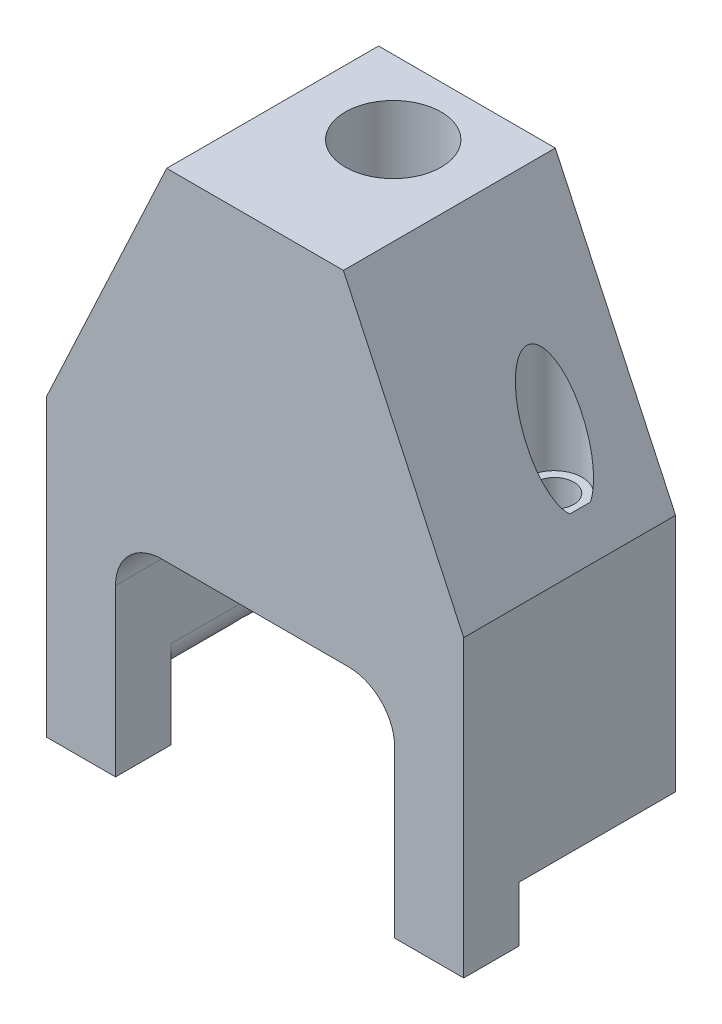
ISO-10303-21;
HEADER;
FILE_DESCRIPTION(('STEP AP214'),'2;1');
FILE_NAME('part.step','',(''),(''),'','','');
FILE_SCHEMA(('AUTOMOTIVE_DESIGN { 1 0 10303 214 1 1 1 1 }'));
ENDSEC;
DATA;
#1=APPLICATION_CONTEXT('core data for automotive mechanical design processes');
#2=APPLICATION_PROTOCOL_DEFINITION('international standard','automotive_design',2000,#1);
#3=PRODUCT_CONTEXT('',#1,'mechanical');
#4=PRODUCT('Part','Part','',(#3));
#5=PRODUCT_RELATED_PRODUCT_CATEGORY('part','',(#4));
#6=PRODUCT_DEFINITION_FORMATION('','',#4);
#7=PRODUCT_DEFINITION_CONTEXT('part definition',#1,'design');
#8=PRODUCT_DEFINITION('design','',#6,#7);
#9=PRODUCT_DEFINITION_SHAPE('','',#8);
#10=(LENGTH_UNIT() NAMED_UNIT(*) SI_UNIT(.MILLI.,.METRE.));
#11=(NAMED_UNIT(*) PLANE_ANGLE_UNIT() SI_UNIT($,.RADIAN.));
#12=(NAMED_UNIT(*) SI_UNIT($,.STERADIAN.) SOLID_ANGLE_UNIT());
#13=UNCERTAINTY_MEASURE_WITH_UNIT(LENGTH_MEASURE(1.E-05),#10,'distance_accuracy_value','');
#14=(GEOMETRIC_REPRESENTATION_CONTEXT(3) GLOBAL_UNCERTAINTY_ASSIGNED_CONTEXT((#13)) GLOBAL_UNIT_ASSIGNED_CONTEXT((#10,
#11,#12)) REPRESENTATION_CONTEXT('',''));
#15=CARTESIAN_POINT('',(0.,0.,0.));
#16=DIRECTION('',(0.,0.,1.));
#17=DIRECTION('',(1.,0.,0.));
#18=AXIS2_PLACEMENT_3D('',#15,#16,#17);
#19=CARTESIAN_POINT('',(-1.425,0.,-7.25));
#20=DIRECTION('',(0.,1.,0.));
#21=DIRECTION('',(0.,0.,1.));
#22=AXIS2_PLACEMENT_3D('',#19,#20,#21);
#23=CYLINDRICAL_SURFACE('',#22,1.05);
#24=CARTESIAN_POINT('',(-1.76,0.,-6.25487437978916));
#25=CARTESIAN_POINT('',(-1.81348962189329,2.61102334886398E-06,-6.27288473152848));
#26=CARTESIAN_POINT('',(-1.86559263597896,0.0024623517669066,-6.29525356328275));
#27=CARTESIAN_POINT('',(-1.96534175427919,0.0112975128803419,-6.34792986024633));
#28=CARTESIAN_POINT('',(-2.01297551859532,0.0176834270353038,-6.37825847525351));
#29=CARTESIAN_POINT('',(-2.10229584848474,0.0330151949282483,-6.44570797639228));
#30=CARTESIAN_POINT('',(-2.1440109044231,0.0419481155919322,-6.4827942139977));
#31=CARTESIAN_POINT('',(-2.22092413909098,0.0609647069351078,-6.56291151957827));
#32=CARTESIAN_POINT('',(-2.25612317763559,0.0710482255042731,-6.60594180190212));
#33=CARTESIAN_POINT('',(-2.32141240149125,0.0915683570019794,-6.70005909716368));
#34=CARTESIAN_POINT('',(-2.35101622033419,0.10198476467722,-6.75148939521628));
#35=CARTESIAN_POINT('',(-2.4012525956055,0.120756743189348,-6.85891892723447));
#36=CARTESIAN_POINT('',(-2.4218867956963,0.129112691479227,-6.91491732187108));
#37=CARTESIAN_POINT('',(-2.45325508817285,0.142196739695877,-7.02938415701767));
#38=CARTESIAN_POINT('',(-2.46409562573086,0.146963749733259,-7.08781863525544));
#39=CARTESIAN_POINT('',(-2.47574390826318,0.152096062550536,-7.20585461518337));
#40=CARTESIAN_POINT('',(-2.47655786576151,0.152464090959392,-7.2654553713071));
#41=CARTESIAN_POINT('',(-2.46846708656308,0.148886360764392,-7.37908458339458));
#42=CARTESIAN_POINT('',(-2.46032651275219,0.145279744991406,-7.43318069365827));
#43=CARTESIAN_POINT('',(-2.43586147118571,0.134888987593067,-7.53916953160773));
#44=CARTESIAN_POINT('',(-2.41953470328497,0.128103952935334,-7.59106163556735));
#45=CARTESIAN_POINT('',(-2.37881430468075,0.112227787713973,-7.69248001189552));
#46=CARTESIAN_POINT('',(-2.35425802675668,0.103091099984914,-7.74193344423324));
#47=CARTESIAN_POINT('',(-2.29781036844338,0.0839190788928453,-7.83628244380958));
#48=CARTESIAN_POINT('',(-2.26591547329135,0.0738833163371912,-7.88117581214886));
#49=CARTESIAN_POINT('',(-2.19258619143515,0.0535331583952056,-7.96891374236897));
#50=CARTESIAN_POINT('',(-2.15058993633705,0.0432615578278031,-8.01130113385955));
#51=CARTESIAN_POINT('',(-2.05971309749708,0.0250893112822279,-8.08856625345505));
#52=CARTESIAN_POINT('',(-2.01083357044889,0.0171883019616764,-8.12344513216386));
#53=CARTESIAN_POINT('',(-1.90862680199955,0.00555091721634934,-8.18383362192099));
#54=CARTESIAN_POINT('',(-1.85542617004798,0.00172381393630806,-8.20953847844388));
#55=CARTESIAN_POINT('',(-1.74536727079132,-0.000796482371158534,-8.25166248599735));
#56=CARTESIAN_POINT('',(-1.68851248682328,0.000505504629069471,-8.26809033833471));
#57=CARTESIAN_POINT('',(-1.5791592661224,0.00854534451876368,-8.28996337808716));
#58=CARTESIAN_POINT('',(-1.52680619789193,0.0147166139952498,-8.29635597911447));
#59=CARTESIAN_POINT('',(-1.42252511755504,0.0318503216446186,-8.3012934888184));
#60=CARTESIAN_POINT('',(-1.37059709277135,0.0428126163869079,-8.29983863241231));
#61=CARTESIAN_POINT('',(-1.26983808185206,0.0688495177351853,-8.2896789746184));
#62=CARTESIAN_POINT('',(-1.22096326493355,0.0838232902488106,-8.28114240759889));
#63=CARTESIAN_POINT('',(-1.12606701479174,0.117360348913741,-8.25773509289154));
#64=CARTESIAN_POINT('',(-1.08004630431857,0.135924539410489,-8.24286274822652));
#65=CARTESIAN_POINT('',(-0.986588277063192,0.178118764088859,-8.20556410900481));
#66=CARTESIAN_POINT('',(-0.939566711413043,0.202083007946433,-8.18247969877748));
#67=CARTESIAN_POINT('',(-0.85037308684014,0.252416754416633,-8.13032817169681));
#68=CARTESIAN_POINT('',(-0.808205261979927,0.278788321592054,-8.10125589218562));
#69=CARTESIAN_POINT('',(-0.721471288691963,0.337921454998297,-8.03179028183773));
#70=CARTESIAN_POINT('',(-0.677966692796402,0.370946444437754,-7.99029556550342));
#71=CARTESIAN_POINT('',(-0.598481915293997,0.436697172863734,-7.90036471673259));
#72=CARTESIAN_POINT('',(-0.56250485247785,0.469422782463211,-7.8519257211091));
#73=CARTESIAN_POINT('',(-0.505817738401247,0.52475550152822,-7.75974498592748));
#74=CARTESIAN_POINT('',(-0.483492666295168,0.547989261803892,-7.7173734830333));
#75=CARTESIAN_POINT('',(-0.444340307296854,0.590609865009204,-7.62836522065786));
#76=CARTESIAN_POINT('',(-0.427501584380942,0.610004676461515,-7.58173759613523));
#77=CARTESIAN_POINT('',(-0.403704562812848,0.638252966253018,-7.49673872161163));
#78=CARTESIAN_POINT('',(-0.395325538230213,0.648531314126953,-7.45924993648326));
#79=CARTESIAN_POINT('',(-0.382687014361997,0.664229498720204,-7.38260973687285));
#80=CARTESIAN_POINT('',(-0.378420452321128,0.669657663982522,-7.34346129387865));
#81=CARTESIAN_POINT('',(-0.374347523687869,0.674836199281019,-7.26432486926255));
#82=CARTESIAN_POINT('',(-0.374565392175598,0.674555718334309,-7.22433349333338));
#83=CARTESIAN_POINT('',(-0.379499102086931,0.668289998384486,-7.14507414805851));
#84=CARTESIAN_POINT('',(-0.384219435103838,0.662299062718725,-7.10580694101018));
#85=CARTESIAN_POINT('',(-0.399106469902521,0.643876620072614,-7.02147529572434));
#86=CARTESIAN_POINT('',(-0.410167048010434,0.630404121710729,-6.97680394144242));
#87=CARTESIAN_POINT('',(-0.437321800074862,0.5987261430276,-6.8907807377209));
#88=CARTESIAN_POINT('',(-0.45342898750939,0.580508447185569,-6.84943782161344));
#89=CARTESIAN_POINT('',(-0.498471975750445,0.532124828480548,-6.75187929963877));
#90=CARTESIAN_POINT('',(-0.529895494511306,0.500329937188679,-6.69762957213765));
#91=CARTESIAN_POINT('',(-0.600978220493032,0.434621584262082,-6.59630043713711));
#92=CARTESIAN_POINT('',(-0.640648772486078,0.400705249740797,-6.54923106335525));
#93=CARTESIAN_POINT('',(-0.729033988405314,0.332443782127592,-6.46125099582135));
#94=CARTESIAN_POINT('',(-0.777973253339873,0.29811377051761,-6.42055284122244));
#95=CARTESIAN_POINT('',(-0.883697924719227,0.232402322902233,-6.34800999368179));
#96=CARTESIAN_POINT('',(-0.940468830631174,0.201015613639489,-6.31614925884378));
#97=CARTESIAN_POINT('',(-1.0488353376261,0.149196919369778,-6.26828751723422));
#98=CARTESIAN_POINT('',(-1.09914126319489,0.127834619344683,-6.25037980549581));
#99=CARTESIAN_POINT('',(-1.20345051659415,0.0893912089929925,-6.22222180175219));
#100=CARTESIAN_POINT('',(-1.2574530636879,0.0723091981876164,-6.21196989823296));
#101=CARTESIAN_POINT('',(-1.36814852857221,0.0432155665857048,-6.20005369162368));
#102=CARTESIAN_POINT('',(-1.4248571558868,0.0312389762873841,-6.19844786649279));
#103=CARTESIAN_POINT('',(-1.53861984094079,0.0130334440029328,-6.20462031896517));
#104=CARTESIAN_POINT('',(-1.5956728022643,0.00679132759799091,-6.21237699167455));
#105=CARTESIAN_POINT('',(-1.67004436482333,0.00220364471645471,-6.22882087558492));
#106=CARTESIAN_POINT('',(-1.68821919658475,0.00137154408423591,-6.23335510900981));
#107=CARTESIAN_POINT('',(-1.72431364212935,0.000269348363575766,-6.24339087691236));
#108=CARTESIAN_POINT('',(-1.74223330982942,-8.67256885082325E-07,-6.24889220366061));
#109=CARTESIAN_POINT('',(-1.76,0.,-6.25487437978916));
#110=B_SPLINE_CURVE_WITH_KNOTS('',3,(#24,#25,#26,#27,#28,#29,#30,#31,#32,#33,#34,#35,#36,#37,
#38,#39,#40,#41,#42,#43,#44,#45,#46,#47,#48,#49,#50,#51,#52,#53,#54,#55,#56,#57,#58,#59,#60,#61,
#62,#63,#64,#65,#66,#67,#68,#69,#70,#71,#72,#73,#74,#75,#76,#77,#78,#79,#80,#81,#82,#83,#84,#85,
#86,#87,#88,#89,#90,#91,#92,#93,#94,#95,#96,#97,#98,#99,#100,#101,#102,#103,#104,#105,#106,#107,
#108,#109),.UNSPECIFIED.,.T.,.F.,(4,2,2,2,2,2,2,2,2,2,2,2,2,2,2,2,2,2,2,2,2,2,2,2,2,2,2,2,2,2,2,
2,2,2,2,2,2,2,2,2,2,2,4),(0.,0.169242462067032,0.33893924985737,0.507789252883586,
0.676616959556563,0.856515451324507,1.03638096318811,1.21426717895023,1.39204316988899,
1.55574768212662,1.71949821762328,1.88669734820386,2.0539767245656,2.23474589899906,
2.41548735262911,2.59211353234183,2.76857377032219,2.92707903961283,3.08557956400099,
3.24041906607325,3.3952976196409,3.56747245057144,3.73979635437426,3.94479818172765,
4.14988477752306,4.30912923875056,4.46803960697177,4.58688340321478,4.70552273117768,
4.82480338580345,4.94420315766563,5.08726248802434,5.23069379846801,5.44046816098526,
5.65053302549553,5.86655584302507,6.08218392558586,6.25402997656477,6.42583984450054,
6.59881030628016,6.77138238347065,6.82760868499096,6.88382292395584),.UNSPECIFIED.);
#111=CARTESIAN_POINT('',(-1.76000000000001,0.,-8.24512562021083));
#112=VERTEX_POINT('',#111);
#113=CARTESIAN_POINT('',(-1.76000000000001,0.,-6.25487437978917));
#114=VERTEX_POINT('',#113);
#115=EDGE_CURVE('E272',#112,#114,#110,.T.);
#116=ORIENTED_EDGE('',*,*,#115,.T.);
#117=CARTESIAN_POINT('',(-1.425,0.,-7.25));
#118=DIRECTION('',(0.,1.,0.));
#119=DIRECTION('',(0.,0.,1.));
#120=AXIS2_PLACEMENT_3D('',#117,#118,#119);
#121=CIRCLE('',#120,1.05);
#122=EDGE_CURVE('E279',#112,#114,#121,.T.);
#123=ORIENTED_EDGE('',*,*,#122,.F.);
#124=EDGE_LOOP('',(#116,#123));
#125=FACE_BOUND('',#124,.T.);
#126=CARTESIAN_POINT('',(-1.425,15.,-7.25));
#127=DIRECTION('',(0.,1.,0.));
#128=DIRECTION('',(0.,0.,1.));
#129=AXIS2_PLACEMENT_3D('',#126,#127,#128);
#130=CIRCLE('',#129,1.05);
#131=CARTESIAN_POINT('',(-1.425,15.,-6.2));
#132=VERTEX_POINT('',#131);
#133=EDGE_CURVE('E489',#132,#132,#130,.F.);
#134=ORIENTED_EDGE('',*,*,#133,.F.);
#135=EDGE_LOOP('',(#134));
#136=FACE_BOUND('',#135,.T.);
#137=ADVANCED_FACE('F37',(#125,#136),#23,.F.);
#138=CARTESIAN_POINT('',(16.575,0.,-7.25));
#139=DIRECTION('',(0.,1.,0.));
#140=DIRECTION('',(0.,0.,1.));
#141=AXIS2_PLACEMENT_3D('',#138,#139,#140);
#142=CYLINDRICAL_SURFACE('',#141,1.05);
#143=CARTESIAN_POINT('',(16.575,0.,-7.25));
#144=DIRECTION('',(0.,1.,0.));
#145=DIRECTION('',(0.,0.,-1.));
#146=AXIS2_PLACEMENT_3D('',#143,#144,#145);
#147=CIRCLE('',#146,1.05);
#148=CARTESIAN_POINT('',(16.91,0.,-6.25487437978917));
#149=VERTEX_POINT('',#148);
#150=CARTESIAN_POINT('',(16.91,0.,-8.24512562021084));
#151=VERTEX_POINT('',#150);
#152=EDGE_CURVE('E280',#149,#151,#147,.T.);
#153=ORIENTED_EDGE('',*,*,#152,.F.);
#154=CARTESIAN_POINT('',(16.91,0.,-8.24512562021084));
#155=CARTESIAN_POINT('',(16.8851467228825,-2.07338209205612E-06,-8.25349369548755));
#156=CARTESIAN_POINT('',(16.8599890543913,0.000527187622289443,-8.26092382034186));
#157=CARTESIAN_POINT('',(16.809237157305,0.00270337649948521,-8.27387448442084));
#158=CARTESIAN_POINT('',(16.7836429686697,0.00435020259798822,-8.27939519746252));
#159=CARTESIAN_POINT('',(16.7067218942919,0.0110266571492773,-8.29299789367969));
#160=CARTESIAN_POINT('',(16.6549971434232,0.0177911694995766,-8.29820715306217));
#161=CARTESIAN_POINT('',(16.5521914083919,0.0359627151727551,-8.30101400547651));
#162=CARTESIAN_POINT('',(16.5011105801913,0.0473708517523113,-8.29860978873773));
#163=CARTESIAN_POINT('',(16.4009277023467,0.0744316424810245,-8.28669953816542));
#164=CARTESIAN_POINT('',(16.3518270203332,0.0900871744088335,-8.27718868160981));
#165=CARTESIAN_POINT('',(16.2549097118677,0.125613217075239,-8.25132518340499));
#166=CARTESIAN_POINT('',(16.2072074517958,0.145618024038085,-8.23473286893586));
#167=CARTESIAN_POINT('',(16.1157860657046,0.188574135935288,-8.19556769806441));
#168=CARTESIAN_POINT('',(16.0720676990627,0.211526000613649,-8.17299370467426));
#169=CARTESIAN_POINT('',(15.9820215313844,0.263474322494537,-8.11838749060334));
#170=CARTESIAN_POINT('',(15.9364844893101,0.292839132581507,-8.08540415939093));
#171=CARTESIAN_POINT('',(15.8515732237323,0.352859113237276,-8.01306799558974));
#172=CARTESIAN_POINT('',(15.8122143569728,0.383517266144486,-7.97369977077085));
#173=CARTESIAN_POINT('',(15.7334873016256,0.449842390000071,-7.88141344505556));
#174=CARTESIAN_POINT('',(15.6953959120066,0.485416239889668,-7.82733204183194));
#175=CARTESIAN_POINT('',(15.6291933025756,0.551979249594034,-7.7108758471282));
#176=CARTESIAN_POINT('',(15.6010456914143,0.582984879603489,-7.64853246918193));
#177=CARTESIAN_POINT('',(15.5668602365775,0.622491887089185,-7.54597015394609));
#178=CARTESIAN_POINT('',(15.5565949766273,0.634805206033837,-7.50864278755525));
#179=CARTESIAN_POINT('',(15.5401439130102,0.65489236339644,-7.43194640281023));
#180=CARTESIAN_POINT('',(15.5339493588567,0.662675934916896,-7.39258196134819));
#181=CARTESIAN_POINT('',(15.5260713640225,0.672623978550902,-7.31232453108292));
#182=CARTESIAN_POINT('',(15.5244265947034,0.674740276281424,-7.27142141619677));
#183=CARTESIAN_POINT('',(15.5259307623837,0.672823388657132,-7.18983877610731));
#184=CARTESIAN_POINT('',(15.5290815799098,0.668787790916031,-7.14915934489734));
#185=CARTESIAN_POINT('',(15.5393564326359,0.655919915356144,-7.07314836766901));
#186=CARTESIAN_POINT('',(15.5460782169978,0.647575312901694,-7.03767403285433));
#187=CARTESIAN_POINT('',(15.5627983800758,0.627383507592868,-6.96854944187112));
#188=CARTESIAN_POINT('',(15.5727996617978,0.615533202408422,-6.93490083270058));
#189=CARTESIAN_POINT('',(15.6035443953904,0.580328835269054,-6.84729203040016));
#190=CARTESIAN_POINT('',(15.6269537592733,0.554654556838422,-6.79520388628351));
#191=CARTESIAN_POINT('',(15.6807806316697,0.499798534505156,-6.69679934906868));
#192=CARTESIAN_POINT('',(15.7112163221999,0.470607786408167,-6.65049841915669));
#193=CARTESIAN_POINT('',(15.779924528501,0.409919029440736,-6.56179384442781));
#194=CARTESIAN_POINT('',(15.818471317589,0.378375577123314,-6.51963381784406));
#195=CARTESIAN_POINT('',(15.9022092315252,0.316158470439176,-6.44184549187675));
#196=CARTESIAN_POINT('',(15.947394379606,0.285484062966088,-6.40621138112825));
#197=CARTESIAN_POINT('',(16.0426155322966,0.2276006400948,-6.34323823774064));
#198=CARTESIAN_POINT('',(16.0924502180571,0.20031217732905,-6.315670390356));
#199=CARTESIAN_POINT('',(16.197589158327,0.149574181339764,-6.26848313069515));
#200=CARTESIAN_POINT('',(16.2528914661955,0.126123289662623,-6.24886090212376));
#201=CARTESIAN_POINT('',(16.3683989707822,0.084270148157823,-6.21878420274054));
#202=CARTESIAN_POINT('',(16.4286434917828,0.0659147851638743,-6.20841304704448));
#203=CARTESIAN_POINT('',(16.5516057525218,0.0357202954593124,-6.19845897573834));
#204=CARTESIAN_POINT('',(16.6143196557192,0.0238714572104935,-6.19885993692585));
#205=CARTESIAN_POINT('',(16.716283871479,0.0102389705760018,-6.20879289658402));
#206=CARTESIAN_POINT('',(16.7556260004164,0.00635307218166209,-6.21488980348145));
#207=CARTESIAN_POINT('',(16.8335521408092,0.00122308012313423,-6.23154681328526));
#208=CARTESIAN_POINT('',(16.872135739302,-1.96119318302158E-05,-6.24210928058125));
#209=CARTESIAN_POINT('',(16.91,0.,-6.25487437978917));
#210=B_SPLINE_CURVE_WITH_KNOTS('',3,(#154,#155,#156,#157,#158,#159,#160,#161,#162,#163,#164,
#165,#166,#167,#168,#169,#170,#171,#172,#173,#174,#175,#176,#177,#178,#179,#180,#181,#182,#183,
#184,#185,#186,#187,#188,#189,#190,#191,#192,#193,#194,#195,#196,#197,#198,#199,#200,#201,#202,
#203,#204,#205,#206,#207,#208,#209),.UNSPECIFIED.,.F.,.F.,(4,2,2,2,2,2,2,2,2,2,2,2,2,2,2,2,2,2,
2,2,2,2,2,2,2,2,2,4),(0.,0.07862627216757,0.157245384966015,0.313674217086594,0.470140236105052,
0.626712532949678,0.789066454050641,0.951451257286256,1.1410525858809,1.33111797759552,
1.55543873102368,1.77892981703349,1.90040042583109,2.02160905684215,2.14384479307255,
2.26612847479861,2.37689264510318,2.48775512956188,2.67454429245169,2.86182233753438,
3.0569240930035,3.25185125535767,3.44054523418463,3.62917227246219,3.81948141694606,
4.00950573146482,4.12918645856764,4.24893063279221),.UNSPECIFIED.);
#211=EDGE_CURVE('E227',#151,#149,#210,.T.);
#212=ORIENTED_EDGE('',*,*,#211,.F.);
#213=EDGE_LOOP('',(#153,#212));
#214=FACE_BOUND('',#213,.T.);
#215=CARTESIAN_POINT('',(16.575,15.,-7.25));
#216=DIRECTION('',(0.,1.,0.));
#217=DIRECTION('',(0.,0.,1.));
#218=AXIS2_PLACEMENT_3D('',#215,#216,#217);
#219=CIRCLE('',#218,1.05);
#220=CARTESIAN_POINT('',(16.575,15.,-6.2));
#221=VERTEX_POINT('',#220);
#222=EDGE_CURVE('E492',#221,#221,#219,.F.);
#223=ORIENTED_EDGE('',*,*,#222,.F.);
#224=EDGE_LOOP('',(#223));
#225=FACE_BOUND('',#224,.T.);
#226=ADVANCED_FACE('F242',(#214,#225),#142,.F.);
#227=CARTESIAN_POINT('',(7.575,-3.,-7.5));
#228=DIRECTION('',(0.,1.,0.));
#229=DIRECTION('',(0.,0.,1.));
#230=AXIS2_PLACEMENT_3D('',#227,#228,#229);
#231=CYLINDRICAL_SURFACE('',#230,1.25);
#232=CARTESIAN_POINT('',(7.575,8.5,-7.5));
#233=DIRECTION('',(0.,-1.,0.));
#234=DIRECTION('',(0.,0.,-1.));
#235=AXIS2_PLACEMENT_3D('',#232,#233,#234);
#236=CIRCLE('',#235,1.25);
#237=CARTESIAN_POINT('',(7.575,8.5,-8.75));
#238=VERTEX_POINT('',#237);
#239=EDGE_CURVE('E202',#238,#238,#236,.T.);
#240=ORIENTED_EDGE('',*,*,#239,.T.);
#241=EDGE_LOOP('',(#240));
#242=FACE_BOUND('',#241,.T.);
#243=CARTESIAN_POINT('',(7.575,22.,-7.5));
#244=DIRECTION('',(0.,1.,0.));
#245=DIRECTION('',(0.,0.,1.));
#246=AXIS2_PLACEMENT_3D('',#243,#244,#245);
#247=CIRCLE('',#246,1.25);
#248=CARTESIAN_POINT('',(7.575,22.,-6.25));
#249=VERTEX_POINT('',#248);
#250=EDGE_CURVE('E199',#249,#249,#247,.F.);
#251=ORIENTED_EDGE('',*,*,#250,.F.);
#252=EDGE_LOOP('',(#251));
#253=FACE_BOUND('',#252,.T.);
#254=ADVANCED_FACE('F247',(#242,#253),#231,.F.);
#255=CARTESIAN_POINT('',(16.91,0.,-11.5));
#256=DIRECTION('',(0.,-1.,0.));
#257=DIRECTION('',(0.,0.,-1.));
#258=AXIS2_PLACEMENT_3D('',#255,#256,#257);
#259=PLANE('',#258);
#260=DIRECTION('',(0.,0.,1.));
#261=VECTOR('',#260,1.);
#262=CARTESIAN_POINT('',(18.9,0.,-11.5));
#263=LINE('',#262,#261);
#264=CARTESIAN_POINT('',(18.9,0.,-11.5));
#265=VERTEX_POINT('',#264);
#266=CARTESIAN_POINT('',(18.9,0.,-3.));
#267=VERTEX_POINT('',#266);
#268=EDGE_CURVE('E236',#265,#267,#263,.T.);
#269=ORIENTED_EDGE('',*,*,#268,.T.);
#270=DIRECTION('',(-1.,0.,0.));
#271=VECTOR('',#270,1.);
#272=CARTESIAN_POINT('',(16.91,0.,-3.));
#273=LINE('',#272,#271);
#274=CARTESIAN_POINT('',(16.91,0.,-3.));
#275=VERTEX_POINT('',#274);
#276=EDGE_CURVE('E373',#267,#275,#273,.T.);
#277=ORIENTED_EDGE('',*,*,#276,.T.);
#278=DIRECTION('',(0.,0.,1.));
#279=VECTOR('',#278,1.);
#280=CARTESIAN_POINT('',(16.91,0.,-11.5));
#281=LINE('',#280,#279);
#282=EDGE_CURVE('E358',#149,#275,#281,.T.);
#283=ORIENTED_EDGE('',*,*,#282,.F.);
#284=ORIENTED_EDGE('',*,*,#152,.T.);
#285=CARTESIAN_POINT('',(16.91,0.,-11.5));
#286=VERTEX_POINT('',#285);
#287=EDGE_CURVE('E359',#286,#151,#281,.T.);
#288=ORIENTED_EDGE('',*,*,#287,.F.);
#289=DIRECTION('',(1.,0.,0.));
#290=VECTOR('',#289,1.);
#291=CARTESIAN_POINT('',(16.91,0.,-11.5));
#292=LINE('',#291,#290);
#293=EDGE_CURVE('E292',#286,#265,#292,.T.);
#294=ORIENTED_EDGE('',*,*,#293,.T.);
#295=EDGE_LOOP('',(#269,#277,#283,#284,#288,#294));
#296=FACE_BOUND('',#295,.T.);
#297=ADVANCED_FACE('F372',(#296),#259,.T.);
#298=CARTESIAN_POINT('',(16.91,1.76,-11.5));
#299=DIRECTION('',(0.,0.,1.));
#300=DIRECTION('',(1.,0.,0.));
#301=AXIS2_PLACEMENT_3D('',#298,#299,#300);
#302=CYLINDRICAL_SURFACE('',#301,1.76);
#303=CARTESIAN_POINT('',(16.91,1.76,-3.));
#304=DIRECTION('',(0.,0.,1.));
#305=DIRECTION('',(1.,0.,0.));
#306=AXIS2_PLACEMENT_3D('',#303,#304,#305);
#307=CIRCLE('',#306,1.76);
#308=CARTESIAN_POINT('',(15.15,1.76,-3.));
#309=VERTEX_POINT('',#308);
#310=EDGE_CURVE('E368',#309,#275,#307,.T.);
#311=ORIENTED_EDGE('',*,*,#310,.F.);
#312=DIRECTION('',(0.,0.,1.));
#313=VECTOR('',#312,1.);
#314=CARTESIAN_POINT('',(15.15,1.76,-11.5));
#315=LINE('',#314,#313);
#316=CARTESIAN_POINT('',(15.15,1.76,-11.5));
#317=VERTEX_POINT('',#316);
#318=EDGE_CURVE('E356',#317,#309,#315,.T.);
#319=ORIENTED_EDGE('',*,*,#318,.F.);
#320=CARTESIAN_POINT('',(16.91,1.76,-11.5));
#321=DIRECTION('',(0.,0.,-1.));
#322=DIRECTION('',(-1.,0.,0.));
#323=AXIS2_PLACEMENT_3D('',#320,#321,#322);
#324=CIRCLE('',#323,1.76);
#325=EDGE_CURVE('E295',#286,#317,#324,.T.);
#326=ORIENTED_EDGE('',*,*,#325,.F.);
#327=ORIENTED_EDGE('',*,*,#287,.T.);
#328=ORIENTED_EDGE('',*,*,#211,.T.);
#329=ORIENTED_EDGE('',*,*,#282,.T.);
#330=EDGE_LOOP('',(#311,#319,#326,#327,#328,#329));
#331=FACE_BOUND('',#330,.T.);
#332=ADVANCED_FACE('F238',(#331),#302,.T.);
#333=CARTESIAN_POINT('',(-3.75,0.,-11.5));
#334=DIRECTION('',(1.,0.,0.));
#335=DIRECTION('',(0.,0.,-1.));
#336=AXIS2_PLACEMENT_3D('',#333,#334,#335);
#337=PLANE('',#336);
#338=DIRECTION('',(0.,1.,0.));
#339=VECTOR('',#338,1.);
#340=CARTESIAN_POINT('',(-3.75,0.,0.));
#341=LINE('',#340,#339);
#342=CARTESIAN_POINT('',(-3.75,-3.,0.));
#343=VERTEX_POINT('',#342);
#344=CARTESIAN_POINT('',(-3.75,12.9999999999999,0.));
#345=VERTEX_POINT('',#344);
#346=EDGE_CURVE('E278',#343,#345,#341,.T.);
#347=ORIENTED_EDGE('',*,*,#346,.T.);
#348=DIRECTION('',(0.,0.,-1.));
#349=VECTOR('',#348,1.);
#350=CARTESIAN_POINT('',(-3.75,12.9999999999999,-11.5));
#351=LINE('',#350,#349);
#352=CARTESIAN_POINT('',(-3.75,12.9999999999999,-11.5));
#353=VERTEX_POINT('',#352);
#354=EDGE_CURVE('E214',#345,#353,#351,.T.);
#355=ORIENTED_EDGE('',*,*,#354,.T.);
#356=DIRECTION('',(0.,1.,0.));
#357=VECTOR('',#356,1.);
#358=CARTESIAN_POINT('',(-3.75,0.,-11.5));
#359=LINE('',#358,#357);
#360=CARTESIAN_POINT('',(-3.75,0.,-11.5));
#361=VERTEX_POINT('',#360);
#362=EDGE_CURVE('E282',#361,#353,#359,.T.);
#363=ORIENTED_EDGE('',*,*,#362,.F.);
#364=DIRECTION('',(0.,0.,1.));
#365=VECTOR('',#364,1.);
#366=CARTESIAN_POINT('',(-3.75,0.,-11.5));
#367=LINE('',#366,#365);
#368=CARTESIAN_POINT('',(-3.75,0.,-3.));
#369=VERTEX_POINT('',#368);
#370=EDGE_CURVE('E317',#361,#369,#367,.T.);
#371=ORIENTED_EDGE('',*,*,#370,.T.);
#372=DIRECTION('',(0.,-1.,0.));
#373=VECTOR('',#372,1.);
#374=CARTESIAN_POINT('',(-3.75,11.5,-3.));
#375=LINE('',#374,#373);
#376=CARTESIAN_POINT('',(-3.75,-3.,-3.));
#377=VERTEX_POINT('',#376);
#378=EDGE_CURVE('E395',#369,#377,#375,.T.);
#379=ORIENTED_EDGE('',*,*,#378,.T.);
#380=DIRECTION('',(0.,0.,-1.));
#381=VECTOR('',#380,1.);
#382=CARTESIAN_POINT('',(-3.75,-3.,0.));
#383=LINE('',#382,#381);
#384=EDGE_CURVE('E390',#343,#377,#383,.T.);
#385=ORIENTED_EDGE('',*,*,#384,.F.);
#386=EDGE_LOOP('',(#347,#355,#363,#371,#379,#385));
#387=FACE_BOUND('',#386,.T.);
#388=ADVANCED_FACE('F398',(#387),#337,.F.);
#389=CARTESIAN_POINT('',(-3.75,27.,-11.5));
#390=DIRECTION('',(0.,-1.,0.));
#391=DIRECTION('',(0.,0.,-1.));
#392=AXIS2_PLACEMENT_3D('',#389,#390,#391);
#393=PLANE('',#392);
#394=CARTESIAN_POINT('',(7.575,27.,-7.5));
#395=DIRECTION('',(0.,1.,0.));
#396=DIRECTION('',(0.,0.,1.));
#397=AXIS2_PLACEMENT_3D('',#394,#395,#396);
#398=CIRCLE('',#397,2.6);
#399=CARTESIAN_POINT('',(7.575,27.,-4.9));
#400=VERTEX_POINT('',#399);
#401=EDGE_CURVE('E491',#400,#400,#398,.T.);
#402=ORIENTED_EDGE('',*,*,#401,.F.);
#403=EDGE_LOOP('',(#402));
#404=FACE_BOUND('',#403,.T.);
#405=DIRECTION('',(1.,0.,0.));
#406=VECTOR('',#405,1.);
#407=CARTESIAN_POINT('',(-3.75,27.,0.));
#408=LINE('',#407,#406);
#409=CARTESIAN_POINT('',(2.77830721416998,27.,0.));
#410=VERTEX_POINT('',#409);
#411=CARTESIAN_POINT('',(12.37169278583,27.,0.));
#412=VERTEX_POINT('',#411);
#413=EDGE_CURVE('E320',#410,#412,#408,.T.);
#414=ORIENTED_EDGE('',*,*,#413,.T.);
#415=DIRECTION('',(0.,0.,-1.));
#416=VECTOR('',#415,1.);
#417=CARTESIAN_POINT('',(12.37169278583,27.,-11.5));
#418=LINE('',#417,#416);
#419=CARTESIAN_POINT('',(12.37169278583,27.,-11.5));
#420=VERTEX_POINT('',#419);
#421=EDGE_CURVE('E205',#412,#420,#418,.T.);
#422=ORIENTED_EDGE('',*,*,#421,.T.);
#423=DIRECTION('',(1.,0.,0.));
#424=VECTOR('',#423,1.);
#425=CARTESIAN_POINT('',(-3.75,27.,-11.5));
#426=LINE('',#425,#424);
#427=CARTESIAN_POINT('',(2.77830721416998,27.,-11.5));
#428=VERTEX_POINT('',#427);
#429=EDGE_CURVE('E285',#428,#420,#426,.T.);
#430=ORIENTED_EDGE('',*,*,#429,.F.);
#431=DIRECTION('',(0.,0.,1.));
#432=VECTOR('',#431,1.);
#433=CARTESIAN_POINT('',(2.77830721416998,27.,-11.5));
#434=LINE('',#433,#432);
#435=EDGE_CURVE('E218',#428,#410,#434,.T.);
#436=ORIENTED_EDGE('',*,*,#435,.T.);
#437=EDGE_LOOP('',(#414,#422,#430,#436));
#438=FACE_BOUND('',#437,.T.);
#439=ADVANCED_FACE('F469',(#404,#438),#393,.F.);
#440=CARTESIAN_POINT('',(18.9,0.,-11.5));
#441=DIRECTION('',(1.,0.,0.));
#442=DIRECTION('',(0.,0.,-1.));
#443=AXIS2_PLACEMENT_3D('',#440,#441,#442);
#444=PLANE('',#443);
#445=DIRECTION('',(0.,1.,0.));
#446=VECTOR('',#445,1.);
#447=CARTESIAN_POINT('',(18.9,0.,-11.5));
#448=LINE('',#447,#446);
#449=CARTESIAN_POINT('',(18.9,12.9999999999999,-11.5));
#450=VERTEX_POINT('',#449);
#451=EDGE_CURVE('E289',#265,#450,#448,.T.);
#452=ORIENTED_EDGE('',*,*,#451,.T.);
#453=DIRECTION('',(0.,0.,1.));
#454=VECTOR('',#453,1.);
#455=CARTESIAN_POINT('',(18.9,12.9999999999999,0.));
#456=LINE('',#455,#454);
#457=CARTESIAN_POINT('',(18.9,12.9999999999999,0.));
#458=VERTEX_POINT('',#457);
#459=EDGE_CURVE('E209',#450,#458,#456,.T.);
#460=ORIENTED_EDGE('',*,*,#459,.T.);
#461=DIRECTION('',(0.,1.,0.));
#462=VECTOR('',#461,1.);
#463=CARTESIAN_POINT('',(18.9,0.,0.));
#464=LINE('',#463,#462);
#465=CARTESIAN_POINT('',(18.9,-3.,0.));
#466=VERTEX_POINT('',#465);
#467=EDGE_CURVE('E323',#466,#458,#464,.T.);
#468=ORIENTED_EDGE('',*,*,#467,.F.);
#469=DIRECTION('',(0.,0.,-1.));
#470=VECTOR('',#469,1.);
#471=CARTESIAN_POINT('',(18.9,-3.,0.));
#472=LINE('',#471,#470);
#473=CARTESIAN_POINT('',(18.9,-3.,-3.));
#474=VERTEX_POINT('',#473);
#475=EDGE_CURVE('E433',#466,#474,#472,.T.);
#476=ORIENTED_EDGE('',*,*,#475,.T.);
#477=DIRECTION('',(0.,-1.,0.));
#478=VECTOR('',#477,1.);
#479=CARTESIAN_POINT('',(18.9,11.5,-3.));
#480=LINE('',#479,#478);
#481=EDGE_CURVE('E377',#267,#474,#480,.T.);
#482=ORIENTED_EDGE('',*,*,#481,.F.);
#483=ORIENTED_EDGE('',*,*,#268,.F.);
#484=EDGE_LOOP('',(#452,#460,#468,#476,#482,#483));
#485=FACE_BOUND('',#484,.T.);
#486=ADVANCED_FACE('F447',(#485),#444,.T.);
#487=CARTESIAN_POINT('',(15.15,1.76,-11.5));
#488=DIRECTION('',(1.,0.,0.));
#489=DIRECTION('',(0.,1.,0.));
#490=AXIS2_PLACEMENT_3D('',#487,#488,#489);
#491=PLANE('',#490);
#492=DIRECTION('',(0.,1.,0.));
#493=VECTOR('',#492,1.);
#494=CARTESIAN_POINT('',(15.15,1.76,0.));
#495=LINE('',#494,#493);
#496=CARTESIAN_POINT('',(15.15,-3.,0.));
#497=VERTEX_POINT('',#496);
#498=CARTESIAN_POINT('',(15.15,6.,0.));
#499=VERTEX_POINT('',#498);
#500=EDGE_CURVE('E326',#497,#499,#495,.T.);
#501=ORIENTED_EDGE('',*,*,#500,.T.);
#502=DIRECTION('',(0.,0.,1.));
#503=VECTOR('',#502,1.);
#504=CARTESIAN_POINT('',(15.15,6.,-11.5));
#505=LINE('',#504,#503);
#506=CARTESIAN_POINT('',(15.15,6.,-11.5));
#507=VERTEX_POINT('',#506);
#508=EDGE_CURVE('E354',#507,#499,#505,.T.);
#509=ORIENTED_EDGE('',*,*,#508,.F.);
#510=DIRECTION('',(0.,1.,0.));
#511=VECTOR('',#510,1.);
#512=CARTESIAN_POINT('',(15.15,1.76,-11.5));
#513=LINE('',#512,#511);
#514=EDGE_CURVE('E297',#317,#507,#513,.T.);
#515=ORIENTED_EDGE('',*,*,#514,.F.);
#516=ORIENTED_EDGE('',*,*,#318,.T.);
#517=DIRECTION('',(0.,-1.,0.));
#518=VECTOR('',#517,1.);
#519=CARTESIAN_POINT('',(15.15,11.5,-3.));
#520=LINE('',#519,#518);
#521=CARTESIAN_POINT('',(15.15,-3.,-3.));
#522=VERTEX_POINT('',#521);
#523=EDGE_CURVE('E436',#309,#522,#520,.T.);
#524=ORIENTED_EDGE('',*,*,#523,.T.);
#525=DIRECTION('',(0.,0.,-1.));
#526=VECTOR('',#525,1.);
#527=CARTESIAN_POINT('',(15.15,-3.,0.));
#528=LINE('',#527,#526);
#529=EDGE_CURVE('E427',#497,#522,#528,.T.);
#530=ORIENTED_EDGE('',*,*,#529,.F.);
#531=EDGE_LOOP('',(#501,#509,#515,#516,#524,#530));
#532=FACE_BOUND('',#531,.T.);
#533=ADVANCED_FACE('F439',(#532),#491,.F.);
#534=CARTESIAN_POINT('',(12.65,6.,-11.5));
#535=DIRECTION('',(0.,0.,1.));
#536=DIRECTION('',(1.,0.,0.));
#537=AXIS2_PLACEMENT_3D('',#534,#535,#536);
#538=CYLINDRICAL_SURFACE('',#537,2.5);
#539=CARTESIAN_POINT('',(12.65,6.,0.));
#540=DIRECTION('',(0.,0.,-1.));
#541=DIRECTION('',(-1.,0.,0.));
#542=AXIS2_PLACEMENT_3D('',#539,#540,#541);
#543=CIRCLE('',#542,2.5);
#544=CARTESIAN_POINT('',(12.65,8.5,0.));
#545=VERTEX_POINT('',#544);
#546=EDGE_CURVE('E329',#545,#499,#543,.T.);
#547=ORIENTED_EDGE('',*,*,#546,.F.);
#548=DIRECTION('',(0.,0.,1.));
#549=VECTOR('',#548,1.);
#550=CARTESIAN_POINT('',(12.65,8.5,-11.5));
#551=LINE('',#550,#549);
#552=CARTESIAN_POINT('',(12.65,8.5,-11.5));
#553=VERTEX_POINT('',#552);
#554=EDGE_CURVE('E352',#553,#545,#551,.T.);
#555=ORIENTED_EDGE('',*,*,#554,.F.);
#556=CARTESIAN_POINT('',(12.65,6.,-11.5));
#557=DIRECTION('',(0.,0.,-1.));
#558=DIRECTION('',(-1.,0.,0.));
#559=AXIS2_PLACEMENT_3D('',#556,#557,#558);
#560=CIRCLE('',#559,2.5);
#561=EDGE_CURVE('E299',#553,#507,#560,.T.);
#562=ORIENTED_EDGE('',*,*,#561,.T.);
#563=ORIENTED_EDGE('',*,*,#508,.T.);
#564=EDGE_LOOP('',(#547,#555,#562,#563));
#565=FACE_BOUND('',#564,.T.);
#566=ADVANCED_FACE('F454',(#565),#538,.F.);
#567=CARTESIAN_POINT('',(2.5,8.5,-11.5));
#568=DIRECTION('',(0.,-1.,0.));
#569=DIRECTION('',(0.,0.,-1.));
#570=AXIS2_PLACEMENT_3D('',#567,#568,#569);
#571=PLANE('',#570);
#572=ORIENTED_EDGE('',*,*,#239,.F.);
#573=EDGE_LOOP('',(#572));
#574=FACE_BOUND('',#573,.T.);
#575=DIRECTION('',(1.,0.,0.));
#576=VECTOR('',#575,1.);
#577=CARTESIAN_POINT('',(2.5,8.5,0.));
#578=LINE('',#577,#576);
#579=CARTESIAN_POINT('',(2.5,8.5,0.));
#580=VERTEX_POINT('',#579);
#581=EDGE_CURVE('E332',#580,#545,#578,.T.);
#582=ORIENTED_EDGE('',*,*,#581,.F.);
#583=DIRECTION('',(0.,0.,1.));
#584=VECTOR('',#583,1.);
#585=CARTESIAN_POINT('',(2.5,8.5,-11.5));
#586=LINE('',#585,#584);
#587=CARTESIAN_POINT('',(2.5,8.5,-11.5));
#588=VERTEX_POINT('',#587);
#589=EDGE_CURVE('E350',#588,#580,#586,.T.);
#590=ORIENTED_EDGE('',*,*,#589,.F.);
#591=DIRECTION('',(1.,0.,0.));
#592=VECTOR('',#591,1.);
#593=CARTESIAN_POINT('',(2.5,8.5,-11.5));
#594=LINE('',#593,#592);
#595=EDGE_CURVE('E302',#588,#553,#594,.T.);
#596=ORIENTED_EDGE('',*,*,#595,.T.);
#597=ORIENTED_EDGE('',*,*,#554,.T.);
#598=EDGE_LOOP('',(#582,#590,#596,#597));
#599=FACE_BOUND('',#598,.T.);
#600=ADVANCED_FACE('F457',(#574,#599),#571,.T.);
#601=CARTESIAN_POINT('',(2.5,6.,-11.5));
#602=DIRECTION('',(0.,0.,1.));
#603=DIRECTION('',(1.,0.,0.));
#604=AXIS2_PLACEMENT_3D('',#601,#602,#603);
#605=CYLINDRICAL_SURFACE('',#604,2.5);
#606=CARTESIAN_POINT('',(2.5,6.,0.));
#607=DIRECTION('',(0.,0.,-1.));
#608=DIRECTION('',(-1.,0.,0.));
#609=AXIS2_PLACEMENT_3D('',#606,#607,#608);
#610=CIRCLE('',#609,2.5);
#611=CARTESIAN_POINT('',(0.,6.,0.));
#612=VERTEX_POINT('',#611);
#613=EDGE_CURVE('E335',#612,#580,#610,.T.);
#614=ORIENTED_EDGE('',*,*,#613,.F.);
#615=DIRECTION('',(0.,0.,1.));
#616=VECTOR('',#615,1.);
#617=CARTESIAN_POINT('',(0.,6.,-11.5));
#618=LINE('',#617,#616);
#619=CARTESIAN_POINT('',(0.,6.,-11.5));
#620=VERTEX_POINT('',#619);
#621=EDGE_CURVE('E348',#620,#612,#618,.T.);
#622=ORIENTED_EDGE('',*,*,#621,.F.);
#623=CARTESIAN_POINT('',(2.5,6.,-11.5));
#624=DIRECTION('',(0.,0.,-1.));
#625=DIRECTION('',(-1.,0.,0.));
#626=AXIS2_PLACEMENT_3D('',#623,#624,#625);
#627=CIRCLE('',#626,2.5);
#628=EDGE_CURVE('E305',#620,#588,#627,.T.);
#629=ORIENTED_EDGE('',*,*,#628,.T.);
#630=ORIENTED_EDGE('',*,*,#589,.T.);
#631=EDGE_LOOP('',(#614,#622,#629,#630));
#632=FACE_BOUND('',#631,.T.);
#633=ADVANCED_FACE('F459',(#632),#605,.F.);
#634=CARTESIAN_POINT('',(0.,1.76000000000001,-11.5));
#635=DIRECTION('',(1.,0.,0.));
#636=DIRECTION('',(0.,0.,-1.));
#637=AXIS2_PLACEMENT_3D('',#634,#635,#636);
#638=PLANE('',#637);
#639=ORIENTED_EDGE('',*,*,#621,.T.);
#640=DIRECTION('',(0.,1.,0.));
#641=VECTOR('',#640,1.);
#642=CARTESIAN_POINT('',(0.,1.76000000000001,0.));
#643=LINE('',#642,#641);
#644=CARTESIAN_POINT('',(0.,-3.,0.));
#645=VERTEX_POINT('',#644);
#646=EDGE_CURVE('E286',#645,#612,#643,.T.);
#647=ORIENTED_EDGE('',*,*,#646,.F.);
#648=DIRECTION('',(0.,0.,-1.));
#649=VECTOR('',#648,1.);
#650=CARTESIAN_POINT('',(0.,-3.,0.));
#651=LINE('',#650,#649);
#652=CARTESIAN_POINT('',(0.,-3.,-3.));
#653=VERTEX_POINT('',#652);
#654=EDGE_CURVE('E411',#645,#653,#651,.T.);
#655=ORIENTED_EDGE('',*,*,#654,.T.);
#656=DIRECTION('',(0.,-1.,0.));
#657=VECTOR('',#656,1.);
#658=CARTESIAN_POINT('',(0.,11.5,-3.));
#659=LINE('',#658,#657);
#660=CARTESIAN_POINT('',(0.,1.76000000000001,-3.));
#661=VERTEX_POINT('',#660);
#662=EDGE_CURVE('E224',#661,#653,#659,.T.);
#663=ORIENTED_EDGE('',*,*,#662,.F.);
#664=DIRECTION('',(0.,0.,1.));
#665=VECTOR('',#664,1.);
#666=CARTESIAN_POINT('',(0.,1.76000000000001,-11.5));
#667=LINE('',#666,#665);
#668=CARTESIAN_POINT('',(0.,1.76000000000001,-11.5));
#669=VERTEX_POINT('',#668);
#670=EDGE_CURVE('E346',#669,#661,#667,.T.);
#671=ORIENTED_EDGE('',*,*,#670,.F.);
#672=DIRECTION('',(0.,1.,0.));
#673=VECTOR('',#672,1.);
#674=CARTESIAN_POINT('',(0.,1.76000000000001,-11.5));
#675=LINE('',#674,#673);
#676=EDGE_CURVE('E308',#669,#620,#675,.T.);
#677=ORIENTED_EDGE('',*,*,#676,.T.);
#678=EDGE_LOOP('',(#639,#647,#655,#663,#671,#677));
#679=FACE_BOUND('',#678,.T.);
#680=ADVANCED_FACE('F268',(#679),#638,.T.);
#681=CARTESIAN_POINT('',(-1.76,1.76,-11.5));
#682=DIRECTION('',(0.,0.,1.));
#683=DIRECTION('',(1.,0.,0.));
#684=AXIS2_PLACEMENT_3D('',#681,#682,#683);
#685=CYLINDRICAL_SURFACE('',#684,1.76);
#686=CARTESIAN_POINT('',(-1.76,1.76,-3.));
#687=DIRECTION('',(0.,0.,-1.));
#688=DIRECTION('',(-1.,0.,0.));
#689=AXIS2_PLACEMENT_3D('',#686,#687,#688);
#690=CIRCLE('',#689,1.76);
#691=CARTESIAN_POINT('',(-1.76000000000001,0.,-3.));
#692=VERTEX_POINT('',#691);
#693=EDGE_CURVE('E386',#692,#661,#690,.F.);
#694=ORIENTED_EDGE('',*,*,#693,.F.);
#695=DIRECTION('',(0.,0.,1.));
#696=VECTOR('',#695,1.);
#697=CARTESIAN_POINT('',(-1.76000000000001,0.,-11.5));
#698=LINE('',#697,#696);
#699=EDGE_CURVE('E342',#114,#692,#698,.T.);
#700=ORIENTED_EDGE('',*,*,#699,.F.);
#701=ORIENTED_EDGE('',*,*,#115,.F.);
#702=CARTESIAN_POINT('',(-1.76000000000001,0.,-11.5));
#703=VERTEX_POINT('',#702);
#704=EDGE_CURVE('E343',#703,#112,#698,.T.);
#705=ORIENTED_EDGE('',*,*,#704,.F.);
#706=CARTESIAN_POINT('',(-1.76,1.76,-11.5));
#707=DIRECTION('',(0.,0.,1.));
#708=DIRECTION('',(1.,0.,0.));
#709=AXIS2_PLACEMENT_3D('',#706,#707,#708);
#710=CIRCLE('',#709,1.76);
#711=EDGE_CURVE('E311',#703,#669,#710,.T.);
#712=ORIENTED_EDGE('',*,*,#711,.T.);
#713=ORIENTED_EDGE('',*,*,#670,.T.);
#714=EDGE_LOOP('',(#694,#700,#701,#705,#712,#713));
#715=FACE_BOUND('',#714,.T.);
#716=ADVANCED_FACE('F263',(#715),#685,.T.);
#717=CARTESIAN_POINT('',(-3.75,0.,-11.5));
#718=DIRECTION('',(0.,-1.,0.));
#719=DIRECTION('',(0.,0.,-1.));
#720=AXIS2_PLACEMENT_3D('',#717,#718,#719);
#721=PLANE('',#720);
#722=DIRECTION('',(1.,0.,0.));
#723=VECTOR('',#722,1.);
#724=CARTESIAN_POINT('',(-3.75,0.,-3.));
#725=LINE('',#724,#723);
#726=EDGE_CURVE('E221',#369,#692,#725,.T.);
#727=ORIENTED_EDGE('',*,*,#726,.F.);
#728=ORIENTED_EDGE('',*,*,#370,.F.);
#729=DIRECTION('',(1.,0.,0.));
#730=VECTOR('',#729,1.);
#731=CARTESIAN_POINT('',(-3.75,0.,-11.5));
#732=LINE('',#731,#730);
#733=EDGE_CURVE('E314',#361,#703,#732,.T.);
#734=ORIENTED_EDGE('',*,*,#733,.T.);
#735=ORIENTED_EDGE('',*,*,#704,.T.);
#736=ORIENTED_EDGE('',*,*,#122,.T.);
#737=ORIENTED_EDGE('',*,*,#699,.T.);
#738=EDGE_LOOP('',(#727,#728,#734,#735,#736,#737));
#739=FACE_BOUND('',#738,.T.);
#740=ADVANCED_FACE('F255',(#739),#721,.T.);
#741=CARTESIAN_POINT('',(16.91,1.76,-11.5));
#742=DIRECTION('',(0.,0.,-1.));
#743=DIRECTION('',(-1.,0.,0.));
#744=AXIS2_PLACEMENT_3D('',#741,#742,#743);
#745=PLANE('',#744);
#746=ORIENTED_EDGE('',*,*,#429,.T.);
#747=DIRECTION('',(0.422618261740697,-0.906307787036651,0.));
#748=VECTOR('',#747,1.);
#749=CARTESIAN_POINT('',(22.8497434419667,4.52974785446499,-11.5));
#750=LINE('',#749,#748);
#751=EDGE_CURVE('E190',#420,#450,#750,.T.);
#752=ORIENTED_EDGE('',*,*,#751,.T.);
#753=ORIENTED_EDGE('',*,*,#451,.F.);
#754=ORIENTED_EDGE('',*,*,#293,.F.);
#755=ORIENTED_EDGE('',*,*,#325,.T.);
#756=ORIENTED_EDGE('',*,*,#514,.T.);
#757=ORIENTED_EDGE('',*,*,#561,.F.);
#758=ORIENTED_EDGE('',*,*,#595,.F.);
#759=ORIENTED_EDGE('',*,*,#628,.F.);
#760=ORIENTED_EDGE('',*,*,#676,.F.);
#761=ORIENTED_EDGE('',*,*,#711,.F.);
#762=ORIENTED_EDGE('',*,*,#733,.F.);
#763=ORIENTED_EDGE('',*,*,#362,.T.);
#764=DIRECTION('',(-0.422618261740697,-0.906307787036651,0.));
#765=VECTOR('',#764,1.);
#766=CARTESIAN_POINT('',(-4.36516577839059,11.6807727309806,-11.5));
#767=LINE('',#766,#765);
#768=EDGE_CURVE('E212',#353,#428,#767,.F.);
#769=ORIENTED_EDGE('',*,*,#768,.T.);
#770=EDGE_LOOP('',(#746,#752,#753,#754,#755,#756,#757,#758,#759,#760,#761,#762,#763,#769));
#771=FACE_BOUND('',#770,.T.);
#772=ADVANCED_FACE('F251',(#771),#745,.T.);
#773=CARTESIAN_POINT('',(16.91,1.76,0.));
#774=DIRECTION('',(0.,0.,-1.));
#775=DIRECTION('',(-1.,0.,0.));
#776=AXIS2_PLACEMENT_3D('',#773,#774,#775);
#777=PLANE('',#776);
#778=ORIENTED_EDGE('',*,*,#467,.T.);
#779=DIRECTION('',(-0.422618261740697,0.906307787036651,0.));
#780=VECTOR('',#779,1.);
#781=CARTESIAN_POINT('',(18.9,12.9999999999999,0.));
#782=LINE('',#781,#780);
#783=EDGE_CURVE('E207',#458,#412,#782,.T.);
#784=ORIENTED_EDGE('',*,*,#783,.T.);
#785=ORIENTED_EDGE('',*,*,#413,.F.);
#786=DIRECTION('',(0.422618261740697,0.906307787036651,0.));
#787=VECTOR('',#786,1.);
#788=CARTESIAN_POINT('',(2.77830721416998,27.,0.));
#789=LINE('',#788,#787);
#790=EDGE_CURVE('E216',#410,#345,#789,.F.);
#791=ORIENTED_EDGE('',*,*,#790,.T.);
#792=ORIENTED_EDGE('',*,*,#346,.F.);
#793=DIRECTION('',(1.,0.,0.));
#794=VECTOR('',#793,1.);
#795=CARTESIAN_POINT('',(-3.75,-3.,0.));
#796=LINE('',#795,#794);
#797=EDGE_CURVE('E414',#343,#645,#796,.T.);
#798=ORIENTED_EDGE('',*,*,#797,.T.);
#799=ORIENTED_EDGE('',*,*,#646,.T.);
#800=ORIENTED_EDGE('',*,*,#613,.T.);
#801=ORIENTED_EDGE('',*,*,#581,.T.);
#802=ORIENTED_EDGE('',*,*,#546,.T.);
#803=ORIENTED_EDGE('',*,*,#500,.F.);
#804=DIRECTION('',(-1.,0.,0.));
#805=VECTOR('',#804,1.);
#806=CARTESIAN_POINT('',(0.,-3.,0.));
#807=LINE('',#806,#805);
#808=EDGE_CURVE('E389',#466,#497,#807,.T.);
#809=ORIENTED_EDGE('',*,*,#808,.F.);
#810=EDGE_LOOP('',(#778,#784,#785,#791,#792,#798,#799,#800,#801,#802,#803,#809));
#811=FACE_BOUND('',#810,.T.);
#812=ADVANCED_FACE('F254',(#811),#777,.F.);
#813=CARTESIAN_POINT('',(0.,11.5,-3.));
#814=DIRECTION('',(0.,0.,1.));
#815=DIRECTION('',(1.,0.,0.));
#816=AXIS2_PLACEMENT_3D('',#813,#814,#815);
#817=PLANE('',#816);
#818=ORIENTED_EDGE('',*,*,#276,.F.);
#819=ORIENTED_EDGE('',*,*,#481,.T.);
#820=DIRECTION('',(-1.,0.,0.));
#821=VECTOR('',#820,1.);
#822=CARTESIAN_POINT('',(0.,-3.,-3.));
#823=LINE('',#822,#821);
#824=EDGE_CURVE('E430',#474,#522,#823,.T.);
#825=ORIENTED_EDGE('',*,*,#824,.T.);
#826=ORIENTED_EDGE('',*,*,#523,.F.);
#827=ORIENTED_EDGE('',*,*,#310,.T.);
#828=EDGE_LOOP('',(#818,#819,#825,#826,#827));
#829=FACE_BOUND('',#828,.T.);
#830=ADVANCED_FACE('F259',(#829),#817,.F.);
#831=CARTESIAN_POINT('',(0.,-3.,0.));
#832=DIRECTION('',(0.,-1.,0.));
#833=DIRECTION('',(0.,0.,-1.));
#834=AXIS2_PLACEMENT_3D('',#831,#832,#833);
#835=PLANE('',#834);
#836=ORIENTED_EDGE('',*,*,#808,.T.);
#837=ORIENTED_EDGE('',*,*,#529,.T.);
#838=ORIENTED_EDGE('',*,*,#824,.F.);
#839=ORIENTED_EDGE('',*,*,#475,.F.);
#840=EDGE_LOOP('',(#836,#837,#838,#839));
#841=FACE_BOUND('',#840,.T.);
#842=ADVANCED_FACE('F443',(#841),#835,.T.);
#843=CARTESIAN_POINT('',(-3.75,11.5,-3.));
#844=DIRECTION('',(0.,0.,-1.));
#845=DIRECTION('',(-1.,0.,0.));
#846=AXIS2_PLACEMENT_3D('',#843,#844,#845);
#847=PLANE('',#846);
#848=ORIENTED_EDGE('',*,*,#726,.T.);
#849=ORIENTED_EDGE('',*,*,#693,.T.);
#850=ORIENTED_EDGE('',*,*,#662,.T.);
#851=DIRECTION('',(1.,0.,0.));
#852=VECTOR('',#851,1.);
#853=CARTESIAN_POINT('',(-3.75,-3.,-3.));
#854=LINE('',#853,#852);
#855=EDGE_CURVE('E421',#377,#653,#854,.T.);
#856=ORIENTED_EDGE('',*,*,#855,.F.);
#857=ORIENTED_EDGE('',*,*,#378,.F.);
#858=EDGE_LOOP('',(#848,#849,#850,#856,#857));
#859=FACE_BOUND('',#858,.T.);
#860=ADVANCED_FACE('F393',(#859),#847,.T.);
#861=CARTESIAN_POINT('',(0.,-3.,0.));
#862=DIRECTION('',(0.,-1.,0.));
#863=DIRECTION('',(0.,0.,-1.));
#864=AXIS2_PLACEMENT_3D('',#861,#862,#863);
#865=PLANE('',#864);
#866=ORIENTED_EDGE('',*,*,#384,.T.);
#867=ORIENTED_EDGE('',*,*,#855,.T.);
#868=ORIENTED_EDGE('',*,*,#654,.F.);
#869=ORIENTED_EDGE('',*,*,#797,.F.);
#870=EDGE_LOOP('',(#866,#867,#868,#869));
#871=FACE_BOUND('',#870,.T.);
#872=ADVANCED_FACE('F462',(#871),#865,.T.);
#873=CARTESIAN_POINT('',(2.77830721416998,27.,-11.5));
#874=DIRECTION('',(0.906307787036651,-0.422618261740697,0.));
#875=DIRECTION('',(0.,0.,1.));
#876=AXIS2_PLACEMENT_3D('',#873,#874,#875);
#877=PLANE('',#876);
#878=CARTESIAN_POINT('',(-1.425,17.9859785901847,-7.25));
#879=DIRECTION('',(0.906307787036651,-0.422618261740697,0.));
#880=DIRECTION('',(0.422618261740697,0.906307787036651,0.));
#881=AXIS2_PLACEMENT_3D('',#878,#879,#880);
#882=ELLIPSE('',#881,3.54930237472877,1.5);
#883=CARTESIAN_POINT('',(-2.81738468368996,15.,-6.6920888129589));
#884=VERTEX_POINT('',#883);
#885=CARTESIAN_POINT('',(-2.81738468368996,15.,-7.80791118704109));
#886=VERTEX_POINT('',#885);
#887=EDGE_CURVE('E11',#884,#886,#882,.F.);
#888=ORIENTED_EDGE('',*,*,#887,.F.);
#889=DIRECTION('',(0.,0.,1.));
#890=VECTOR('',#889,1.);
#891=CARTESIAN_POINT('',(-2.81738468368996,15.,-11.5));
#892=LINE('',#891,#890);
#893=EDGE_CURVE('E46',#884,#886,#892,.F.);
#894=ORIENTED_EDGE('',*,*,#893,.T.);
#895=EDGE_LOOP('',(#888,#894));
#896=FACE_BOUND('',#895,.T.);
#897=ORIENTED_EDGE('',*,*,#768,.F.);
#898=ORIENTED_EDGE('',*,*,#354,.F.);
#899=ORIENTED_EDGE('',*,*,#790,.F.);
#900=ORIENTED_EDGE('',*,*,#435,.F.);
#901=EDGE_LOOP('',(#897,#898,#899,#900));
#902=FACE_BOUND('',#901,.T.);
#903=ADVANCED_FACE('F464',(#896,#902),#877,.F.);
#904=CARTESIAN_POINT('',(18.9,12.9999999999999,-11.5));
#905=DIRECTION('',(0.906307787036651,0.422618261740697,0.));
#906=DIRECTION('',(0.,0.,-1.));
#907=AXIS2_PLACEMENT_3D('',#904,#905,#906);
#908=PLANE('',#907);
#909=CARTESIAN_POINT('',(16.575,17.9859785901847,-7.25));
#910=DIRECTION('',(0.906307787036651,0.422618261740697,0.));
#911=DIRECTION('',(-0.422618261740697,0.906307787036651,0.));
#912=AXIS2_PLACEMENT_3D('',#909,#910,#911);
#913=ELLIPSE('',#912,3.54930237472877,1.5);
#914=CARTESIAN_POINT('',(17.96738468369,15.,-7.80791118704109));
#915=VERTEX_POINT('',#914);
#916=CARTESIAN_POINT('',(17.96738468369,15.,-6.69208881295891));
#917=VERTEX_POINT('',#916);
#918=EDGE_CURVE('E189',#915,#917,#913,.T.);
#919=ORIENTED_EDGE('',*,*,#918,.F.);
#920=DIRECTION('',(0.,0.,1.));
#921=VECTOR('',#920,1.);
#922=CARTESIAN_POINT('',(17.96738468369,15.,-11.5));
#923=LINE('',#922,#921);
#924=EDGE_CURVE('E184',#915,#917,#923,.T.);
#925=ORIENTED_EDGE('',*,*,#924,.T.);
#926=EDGE_LOOP('',(#919,#925));
#927=FACE_BOUND('',#926,.T.);
#928=ORIENTED_EDGE('',*,*,#751,.F.);
#929=ORIENTED_EDGE('',*,*,#421,.F.);
#930=ORIENTED_EDGE('',*,*,#783,.F.);
#931=ORIENTED_EDGE('',*,*,#459,.F.);
#932=EDGE_LOOP('',(#928,#929,#930,#931));
#933=FACE_BOUND('',#932,.T.);
#934=ADVANCED_FACE('F40',(#927,#933),#908,.T.);
#935=CARTESIAN_POINT('',(7.575,22.,-7.5));
#936=DIRECTION('',(0.,1.,0.));
#937=DIRECTION('',(0.,0.,1.));
#938=AXIS2_PLACEMENT_3D('',#935,#936,#937);
#939=PLANE('',#938);
#940=CARTESIAN_POINT('',(7.575,22.,-7.5));
#941=DIRECTION('',(0.,1.,0.));
#942=DIRECTION('',(0.,0.,1.));
#943=AXIS2_PLACEMENT_3D('',#940,#941,#942);
#944=CIRCLE('',#943,2.6);
#945=CARTESIAN_POINT('',(7.575,22.,-4.9));
#946=VERTEX_POINT('',#945);
#947=EDGE_CURVE('E203',#946,#946,#944,.T.);
#948=ORIENTED_EDGE('',*,*,#947,.T.);
#949=EDGE_LOOP('',(#948));
#950=FACE_BOUND('',#949,.T.);
#951=ORIENTED_EDGE('',*,*,#250,.T.);
#952=EDGE_LOOP('',(#951));
#953=FACE_BOUND('',#952,.T.);
#954=ADVANCED_FACE('F474',(#950,#953),#939,.T.);
#955=CARTESIAN_POINT('',(7.575,22.,-7.5));
#956=DIRECTION('',(0.,1.,0.));
#957=DIRECTION('',(0.,0.,1.));
#958=AXIS2_PLACEMENT_3D('',#955,#956,#957);
#959=CYLINDRICAL_SURFACE('',#958,2.6);
#960=ORIENTED_EDGE('',*,*,#947,.F.);
#961=EDGE_LOOP('',(#960));
#962=FACE_BOUND('',#961,.T.);
#963=ORIENTED_EDGE('',*,*,#401,.T.);
#964=EDGE_LOOP('',(#963));
#965=FACE_BOUND('',#964,.T.);
#966=ADVANCED_FACE('F479',(#962,#965),#959,.F.);
#967=CARTESIAN_POINT('',(16.575,15.,-7.25));
#968=DIRECTION('',(0.,1.,0.));
#969=DIRECTION('',(0.,0.,1.));
#970=AXIS2_PLACEMENT_3D('',#967,#968,#969);
#971=PLANE('',#970);
#972=CARTESIAN_POINT('',(16.575,15.,-7.25));
#973=DIRECTION('',(0.,1.,0.));
#974=DIRECTION('',(0.,0.,1.));
#975=AXIS2_PLACEMENT_3D('',#972,#973,#974);
#976=CIRCLE('',#975,1.5);
#977=EDGE_CURVE('E58',#915,#917,#976,.T.);
#978=ORIENTED_EDGE('',*,*,#977,.T.);
#979=ORIENTED_EDGE('',*,*,#924,.F.);
#980=EDGE_LOOP('',(#978,#979));
#981=FACE_BOUND('',#980,.T.);
#982=ORIENTED_EDGE('',*,*,#222,.T.);
#983=EDGE_LOOP('',(#982));
#984=FACE_BOUND('',#983,.T.);
#985=ADVANCED_FACE('F185',(#981,#984),#971,.T.);
#986=CARTESIAN_POINT('',(16.575,15.,-7.25));
#987=DIRECTION('',(0.,1.,0.));
#988=DIRECTION('',(0.,0.,1.));
#989=AXIS2_PLACEMENT_3D('',#986,#987,#988);
#990=CYLINDRICAL_SURFACE('',#989,1.5);
#991=ORIENTED_EDGE('',*,*,#918,.T.);
#992=ORIENTED_EDGE('',*,*,#977,.F.);
#993=EDGE_LOOP('',(#991,#992));
#994=FACE_BOUND('',#993,.T.);
#995=ADVANCED_FACE('F193',(#994),#990,.F.);
#996=CARTESIAN_POINT('',(-1.425,15.,-7.25));
#997=DIRECTION('',(0.,1.,0.));
#998=DIRECTION('',(0.,0.,1.));
#999=AXIS2_PLACEMENT_3D('',#996,#997,#998);
#1000=PLANE('',#999);
#1001=CARTESIAN_POINT('',(-1.425,15.,-7.25));
#1002=DIRECTION('',(0.,1.,0.));
#1003=DIRECTION('',(0.,0.,1.));
#1004=AXIS2_PLACEMENT_3D('',#1001,#1002,#1003);
#1005=CIRCLE('',#1004,1.5);
#1006=EDGE_CURVE('E52',#884,#886,#1005,.T.);
#1007=ORIENTED_EDGE('',*,*,#1006,.T.);
#1008=ORIENTED_EDGE('',*,*,#893,.F.);
#1009=EDGE_LOOP('',(#1007,#1008));
#1010=FACE_BOUND('',#1009,.T.);
#1011=ORIENTED_EDGE('',*,*,#133,.T.);
#1012=EDGE_LOOP('',(#1011));
#1013=FACE_BOUND('',#1012,.T.);
#1014=ADVANCED_FACE('F585',(#1010,#1013),#1000,.T.);
#1015=CARTESIAN_POINT('',(-1.425,15.,-7.25));
#1016=DIRECTION('',(0.,1.,0.));
#1017=DIRECTION('',(0.,0.,1.));
#1018=AXIS2_PLACEMENT_3D('',#1015,#1016,#1017);
#1019=CYLINDRICAL_SURFACE('',#1018,1.5);
#1020=ORIENTED_EDGE('',*,*,#887,.T.);
#1021=ORIENTED_EDGE('',*,*,#1006,.F.);
#1022=EDGE_LOOP('',(#1020,#1021));
#1023=FACE_BOUND('',#1022,.T.);
#1024=ADVANCED_FACE('F594',(#1023),#1019,.F.);
#1025=CLOSED_SHELL('',(#137,#226,#254,#297,#332,#388,#439,#486,#533,#566,#600,#633,#680,#716,
#740,#772,#812,#830,#842,#860,#872,#903,#934,#954,#966,#985,#995,#1014,#1024));
#1026=MANIFOLD_SOLID_BREP('B2',#1025);
#1027=ADVANCED_BREP_SHAPE_REPRESENTATION('',(#18,#1026),#14);
#1028=SHAPE_DEFINITION_REPRESENTATION(#9,#1027);
ENDSEC;
END-ISO-10303-21;
